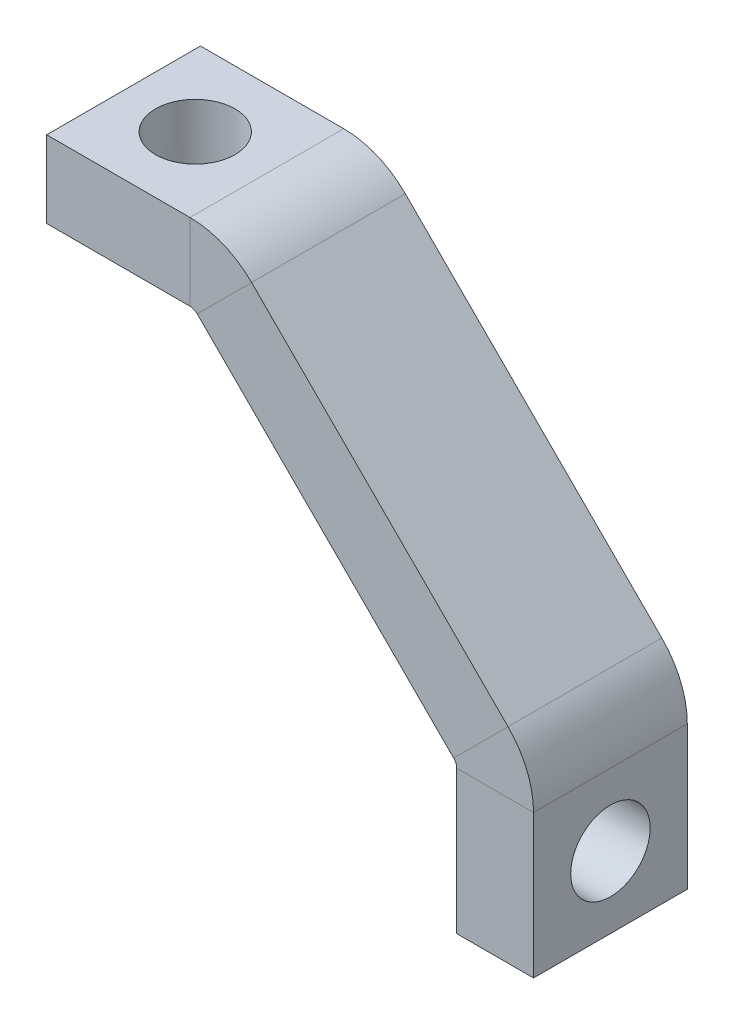
ISO-10303-21;
HEADER;
FILE_DESCRIPTION(('STEP AP214'),'2;1');
FILE_NAME('part.step','',(''),(''),'','','');
FILE_SCHEMA(('AUTOMOTIVE_DESIGN { 1 0 10303 214 1 1 1 1 }'));
ENDSEC;
DATA;
#1=APPLICATION_CONTEXT('core data for automotive mechanical design processes');
#2=APPLICATION_PROTOCOL_DEFINITION('international standard','automotive_design',2000,#1);
#3=PRODUCT_CONTEXT('',#1,'mechanical');
#4=PRODUCT('Part','Part','',(#3));
#5=PRODUCT_RELATED_PRODUCT_CATEGORY('part','',(#4));
#6=PRODUCT_DEFINITION_FORMATION('','',#4);
#7=PRODUCT_DEFINITION_CONTEXT('part definition',#1,'design');
#8=PRODUCT_DEFINITION('design','',#6,#7);
#9=PRODUCT_DEFINITION_SHAPE('','',#8);
#10=(LENGTH_UNIT() NAMED_UNIT(*) SI_UNIT(.MILLI.,.METRE.));
#11=(NAMED_UNIT(*) PLANE_ANGLE_UNIT() SI_UNIT($,.RADIAN.));
#12=(NAMED_UNIT(*) SI_UNIT($,.STERADIAN.) SOLID_ANGLE_UNIT());
#13=UNCERTAINTY_MEASURE_WITH_UNIT(LENGTH_MEASURE(1.E-05),#10,'distance_accuracy_value','');
#14=(GEOMETRIC_REPRESENTATION_CONTEXT(3) GLOBAL_UNCERTAINTY_ASSIGNED_CONTEXT((#13)) GLOBAL_UNIT_ASSIGNED_CONTEXT((#10,
#11,#12)) REPRESENTATION_CONTEXT('',''));
#15=CARTESIAN_POINT('',(0.,0.,0.));
#16=DIRECTION('',(0.,0.,1.));
#17=DIRECTION('',(1.,0.,0.));
#18=AXIS2_PLACEMENT_3D('',#15,#16,#17);
#19=CARTESIAN_POINT('',(-15.2756472385876,3.33215679776446,6.));
#20=DIRECTION('',(0.,0.,1.));
#21=DIRECTION('',(0.707106781186547,-0.707106781186548,0.));
#22=AXIS2_PLACEMENT_3D('',#19,#20,#21);
#23=PLANE('',#22);
#24=DIRECTION('',(-0.707106781186548,-0.707106781186547,0.));
#25=VECTOR('',#24,1.);
#26=CARTESIAN_POINT('',(-4.2714841825533,-7.6720062582698,6.));
#27=LINE('',#26,#25);
#28=CARTESIAN_POINT('',(-4.2714841825533,-7.6720062582698,6.));
#29=VERTEX_POINT('',#28);
#30=CARTESIAN_POINT('',(-6.39280452611294,-9.79332660182944,6.));
#31=VERTEX_POINT('',#30);
#32=EDGE_CURVE('E11',#29,#31,#27,.T.);
#33=ORIENTED_EDGE('',*,*,#32,.F.);
#34=DIRECTION('',(0.707106781186547,-0.707106781186548,0.));
#35=VECTOR('',#34,1.);
#36=CARTESIAN_POINT('',(-15.2756472385876,3.33215679776446,6.));
#37=LINE('',#36,#35);
#38=CARTESIAN_POINT('',(-14.2798102946218,2.33631985379872,6.));
#39=VERTEX_POINT('',#38);
#40=EDGE_CURVE('E145',#39,#29,#37,.T.);
#41=ORIENTED_EDGE('',*,*,#40,.F.);
#42=DIRECTION('',(-0.707106781186547,-0.707106781186547,0.));
#43=VECTOR('',#42,1.);
#44=CARTESIAN_POINT('',(-14.2798102946218,2.33631985379872,6.));
#45=LINE('',#44,#43);
#46=CARTESIAN_POINT('',(-16.4011306381815,0.214999510239078,6.));
#47=VERTEX_POINT('',#46);
#48=EDGE_CURVE('E49',#39,#47,#45,.T.);
#49=ORIENTED_EDGE('',*,*,#48,.T.);
#50=DIRECTION('',(-0.707106781186547,0.707106781186548,0.));
#51=VECTOR('',#50,1.);
#52=CARTESIAN_POINT('',(-17.3969675821472,1.21083645420482,6.));
#53=LINE('',#52,#51);
#54=EDGE_CURVE('E251',#47,#31,#53,.F.);
#55=ORIENTED_EDGE('',*,*,#54,.T.);
#56=EDGE_LOOP('',(#33,#41,#49,#55));
#57=FACE_BOUND('',#56,.T.);
#58=ADVANCED_FACE('F39',(#57),#23,.T.);
#59=CARTESIAN_POINT('',(-16.6839733506561,-0.0678432022355408,6.));
#60=DIRECTION('',(0.,0.,1.));
#61=DIRECTION('',(1.,0.,0.));
#62=AXIS2_PLACEMENT_3D('',#59,#60,#61);
#63=PLANE('',#62);
#64=ORIENTED_EDGE('',*,*,#48,.F.);
#65=CARTESIAN_POINT('',(-16.6839733506561,-0.0678432022355408,6.));
#66=DIRECTION('',(0.,0.,-1.));
#67=DIRECTION('',(-1.,0.,0.));
#68=AXIS2_PLACEMENT_3D('',#65,#66,#67);
#69=CIRCLE('',#68,3.4);
#70=CARTESIAN_POINT('',(-16.6839733506561,3.33215679776446,6.));
#71=VERTEX_POINT('',#70);
#72=EDGE_CURVE('E160',#39,#71,#69,.F.);
#73=ORIENTED_EDGE('',*,*,#72,.T.);
#74=DIRECTION('',(0.,-1.,0.));
#75=VECTOR('',#74,1.);
#76=CARTESIAN_POINT('',(-16.6839733506561,3.33215679776446,6.));
#77=LINE('',#76,#75);
#78=CARTESIAN_POINT('',(-16.6839733506561,0.332156797764459,6.));
#79=VERTEX_POINT('',#78);
#80=EDGE_CURVE('E211',#71,#79,#77,.T.);
#81=ORIENTED_EDGE('',*,*,#80,.T.);
#82=CARTESIAN_POINT('',(-16.6839733506561,-0.0678432022355408,6.));
#83=DIRECTION('',(0.,0.,1.));
#84=DIRECTION('',(1.,0.,0.));
#85=AXIS2_PLACEMENT_3D('',#82,#83,#84);
#86=CIRCLE('',#85,0.4);
#87=EDGE_CURVE('E252',#47,#79,#86,.T.);
#88=ORIENTED_EDGE('',*,*,#87,.F.);
#89=EDGE_LOOP('',(#64,#73,#81,#88));
#90=FACE_BOUND('',#89,.T.);
#91=ADVANCED_FACE('F298',(#90),#63,.T.);
#92=CARTESIAN_POINT('',(-22.2756472385876,3.33215679776446,6.));
#93=DIRECTION('',(0.,0.,1.));
#94=DIRECTION('',(1.,0.,0.));
#95=AXIS2_PLACEMENT_3D('',#92,#93,#94);
#96=PLANE('',#95);
#97=ORIENTED_EDGE('',*,*,#80,.F.);
#98=DIRECTION('',(1.,0.,0.));
#99=VECTOR('',#98,1.);
#100=CARTESIAN_POINT('',(-22.2756472385876,3.33215679776446,6.));
#101=LINE('',#100,#99);
#102=CARTESIAN_POINT('',(-22.2756472385876,3.33215679776446,6.));
#103=VERTEX_POINT('',#102);
#104=EDGE_CURVE('E173',#103,#71,#101,.T.);
#105=ORIENTED_EDGE('',*,*,#104,.F.);
#106=DIRECTION('',(0.,-1.,0.));
#107=VECTOR('',#106,1.);
#108=CARTESIAN_POINT('',(-22.2756472385876,3.33215679776446,6.));
#109=LINE('',#108,#107);
#110=CARTESIAN_POINT('',(-22.2756472385876,0.332156797764459,6.));
#111=VERTEX_POINT('',#110);
#112=EDGE_CURVE('E209',#103,#111,#109,.T.);
#113=ORIENTED_EDGE('',*,*,#112,.T.);
#114=DIRECTION('',(-1.,0.,0.));
#115=VECTOR('',#114,1.);
#116=CARTESIAN_POINT('',(-22.2756472385876,0.332156797764459,6.));
#117=LINE('',#116,#115);
#118=EDGE_CURVE('E259',#111,#79,#117,.F.);
#119=ORIENTED_EDGE('',*,*,#118,.T.);
#120=EDGE_LOOP('',(#97,#105,#113,#119));
#121=FACE_BOUND('',#120,.T.);
#122=ADVANCED_FACE('F302',(#121),#96,.T.);
#123=CARTESIAN_POINT('',(-22.2756472385876,3.33215679776446,6.));
#124=DIRECTION('',(1.,0.,0.));
#125=DIRECTION('',(0.,0.,-1.));
#126=AXIS2_PLACEMENT_3D('',#123,#124,#125);
#127=PLANE('',#126);
#128=ORIENTED_EDGE('',*,*,#112,.F.);
#129=DIRECTION('',(0.,0.,-1.));
#130=VECTOR('',#129,1.);
#131=CARTESIAN_POINT('',(-22.2756472385876,3.33215679776446,6.));
#132=LINE('',#131,#130);
#133=CARTESIAN_POINT('',(-22.2756472385876,3.33215679776446,0.));
#134=VERTEX_POINT('',#133);
#135=EDGE_CURVE('E176',#103,#134,#132,.T.);
#136=ORIENTED_EDGE('',*,*,#135,.T.);
#137=DIRECTION('',(0.,-1.,0.));
#138=VECTOR('',#137,1.);
#139=CARTESIAN_POINT('',(-22.2756472385876,3.33215679776446,0.));
#140=LINE('',#139,#138);
#141=CARTESIAN_POINT('',(-22.2756472385876,0.332156797764459,0.));
#142=VERTEX_POINT('',#141);
#143=EDGE_CURVE('E207',#134,#142,#140,.T.);
#144=ORIENTED_EDGE('',*,*,#143,.T.);
#145=DIRECTION('',(0.,0.,1.));
#146=VECTOR('',#145,1.);
#147=CARTESIAN_POINT('',(-22.2756472385876,0.332156797764459,6.));
#148=LINE('',#147,#146);
#149=EDGE_CURVE('E247',#111,#142,#148,.F.);
#150=ORIENTED_EDGE('',*,*,#149,.F.);
#151=EDGE_LOOP('',(#128,#136,#144,#150));
#152=FACE_BOUND('',#151,.T.);
#153=ADVANCED_FACE('F308',(#152),#127,.F.);
#154=CARTESIAN_POINT('',(-22.2756472385876,3.33215679776446,0.));
#155=DIRECTION('',(0.,0.,1.));
#156=DIRECTION('',(1.,0.,0.));
#157=AXIS2_PLACEMENT_3D('',#154,#155,#156);
#158=PLANE('',#157);
#159=ORIENTED_EDGE('',*,*,#143,.F.);
#160=DIRECTION('',(1.,0.,0.));
#161=VECTOR('',#160,1.);
#162=CARTESIAN_POINT('',(-22.2756472385876,3.33215679776446,0.));
#163=LINE('',#162,#161);
#164=CARTESIAN_POINT('',(-16.6839733506561,3.33215679776446,0.));
#165=VERTEX_POINT('',#164);
#166=EDGE_CURVE('E162',#134,#165,#163,.T.);
#167=ORIENTED_EDGE('',*,*,#166,.T.);
#168=DIRECTION('',(0.,-1.,0.));
#169=VECTOR('',#168,1.);
#170=CARTESIAN_POINT('',(-16.6839733506561,3.33215679776446,0.));
#171=LINE('',#170,#169);
#172=CARTESIAN_POINT('',(-16.6839733506561,0.332156797764459,0.));
#173=VERTEX_POINT('',#172);
#174=EDGE_CURVE('E205',#165,#173,#171,.T.);
#175=ORIENTED_EDGE('',*,*,#174,.T.);
#176=DIRECTION('',(-1.,0.,0.));
#177=VECTOR('',#176,1.);
#178=CARTESIAN_POINT('',(-22.2756472385876,0.332156797764459,0.));
#179=LINE('',#178,#177);
#180=EDGE_CURVE('E256',#142,#173,#179,.F.);
#181=ORIENTED_EDGE('',*,*,#180,.F.);
#182=EDGE_LOOP('',(#159,#167,#175,#181));
#183=FACE_BOUND('',#182,.T.);
#184=ADVANCED_FACE('F312',(#183),#158,.F.);
#185=CARTESIAN_POINT('',(-16.6839733506561,-0.0678432022355408,0.));
#186=DIRECTION('',(0.,0.,-1.));
#187=DIRECTION('',(-1.,0.,0.));
#188=AXIS2_PLACEMENT_3D('',#185,#186,#187);
#189=PLANE('',#188);
#190=ORIENTED_EDGE('',*,*,#174,.F.);
#191=CARTESIAN_POINT('',(-16.6839733506561,-0.0678432022355408,0.));
#192=DIRECTION('',(0.,0.,1.));
#193=DIRECTION('',(1.,0.,0.));
#194=AXIS2_PLACEMENT_3D('',#191,#192,#193);
#195=CIRCLE('',#194,3.4);
#196=CARTESIAN_POINT('',(-14.2798102946218,2.33631985379872,0.));
#197=VERTEX_POINT('',#196);
#198=EDGE_CURVE('E165',#165,#197,#195,.F.);
#199=ORIENTED_EDGE('',*,*,#198,.T.);
#200=DIRECTION('',(-0.707106781186548,-0.707106781186547,0.));
#201=VECTOR('',#200,1.);
#202=CARTESIAN_POINT('',(-14.2798102946218,2.33631985379872,0.));
#203=LINE('',#202,#201);
#204=CARTESIAN_POINT('',(-16.4011306381815,0.214999510239078,0.));
#205=VERTEX_POINT('',#204);
#206=EDGE_CURVE('E134',#197,#205,#203,.T.);
#207=ORIENTED_EDGE('',*,*,#206,.T.);
#208=CARTESIAN_POINT('',(-16.6839733506561,-0.0678432022355408,0.));
#209=DIRECTION('',(0.,0.,1.));
#210=DIRECTION('',(1.,0.,0.));
#211=AXIS2_PLACEMENT_3D('',#208,#209,#210);
#212=CIRCLE('',#211,0.4);
#213=EDGE_CURVE('E253',#173,#205,#212,.F.);
#214=ORIENTED_EDGE('',*,*,#213,.F.);
#215=EDGE_LOOP('',(#190,#199,#207,#214));
#216=FACE_BOUND('',#215,.T.);
#217=ADVANCED_FACE('F316',(#216),#189,.T.);
#218=CARTESIAN_POINT('',(-15.2756472385876,3.33215679776446,0.));
#219=DIRECTION('',(0.,0.,1.));
#220=DIRECTION('',(0.707106781186547,-0.707106781186548,0.));
#221=AXIS2_PLACEMENT_3D('',#218,#219,#220);
#222=PLANE('',#221);
#223=ORIENTED_EDGE('',*,*,#206,.F.);
#224=DIRECTION('',(0.707106781186547,-0.707106781186548,0.));
#225=VECTOR('',#224,1.);
#226=CARTESIAN_POINT('',(-15.2756472385876,3.33215679776446,0.));
#227=LINE('',#226,#225);
#228=CARTESIAN_POINT('',(-4.2714841825533,-7.6720062582698,0.));
#229=VERTEX_POINT('',#228);
#230=EDGE_CURVE('E143',#197,#229,#227,.T.);
#231=ORIENTED_EDGE('',*,*,#230,.T.);
#232=DIRECTION('',(-0.707106781186547,-0.707106781186547,0.));
#233=VECTOR('',#232,1.);
#234=CARTESIAN_POINT('',(-4.2714841825533,-7.6720062582698,0.));
#235=LINE('',#234,#233);
#236=CARTESIAN_POINT('',(-6.39280452611294,-9.79332660182944,0.));
#237=VERTEX_POINT('',#236);
#238=EDGE_CURVE('E58',#229,#237,#235,.T.);
#239=ORIENTED_EDGE('',*,*,#238,.T.);
#240=DIRECTION('',(-0.707106781186547,0.707106781186548,0.));
#241=VECTOR('',#240,1.);
#242=CARTESIAN_POINT('',(-17.3969675821472,1.21083645420482,0.));
#243=LINE('',#242,#241);
#244=EDGE_CURVE('E249',#205,#237,#243,.F.);
#245=ORIENTED_EDGE('',*,*,#244,.F.);
#246=EDGE_LOOP('',(#223,#231,#239,#245));
#247=FACE_BOUND('',#246,.T.);
#248=ADVANCED_FACE('F158',(#247),#222,.F.);
#249=CARTESIAN_POINT('',(-6.67564723858756,-10.0761693143041,0.));
#250=DIRECTION('',(0.,0.,-1.));
#251=DIRECTION('',(-1.,0.,0.));
#252=AXIS2_PLACEMENT_3D('',#249,#250,#251);
#253=PLANE('',#252);
#254=ORIENTED_EDGE('',*,*,#238,.F.);
#255=CARTESIAN_POINT('',(-6.67564723858756,-10.0761693143041,0.));
#256=DIRECTION('',(0.,0.,1.));
#257=DIRECTION('',(1.,0.,0.));
#258=AXIS2_PLACEMENT_3D('',#255,#256,#257);
#259=CIRCLE('',#258,3.4);
#260=CARTESIAN_POINT('',(-3.27564723858756,-10.0761693143041,0.));
#261=VERTEX_POINT('',#260);
#262=EDGE_CURVE('E130',#229,#261,#259,.F.);
#263=ORIENTED_EDGE('',*,*,#262,.T.);
#264=DIRECTION('',(-1.,0.,0.));
#265=VECTOR('',#264,1.);
#266=CARTESIAN_POINT('',(-3.27564723858756,-10.0761693143041,0.));
#267=LINE('',#266,#265);
#268=CARTESIAN_POINT('',(-6.27564723858756,-10.0761693143041,0.));
#269=VERTEX_POINT('',#268);
#270=EDGE_CURVE('E135',#261,#269,#267,.T.);
#271=ORIENTED_EDGE('',*,*,#270,.T.);
#272=CARTESIAN_POINT('',(-6.67564723858756,-10.0761693143041,0.));
#273=DIRECTION('',(0.,0.,1.));
#274=DIRECTION('',(1.,0.,0.));
#275=AXIS2_PLACEMENT_3D('',#272,#273,#274);
#276=CIRCLE('',#275,0.4);
#277=EDGE_CURVE('E132',#237,#269,#276,.F.);
#278=ORIENTED_EDGE('',*,*,#277,.F.);
#279=EDGE_LOOP('',(#254,#263,#271,#278));
#280=FACE_BOUND('',#279,.T.);
#281=ADVANCED_FACE('F127',(#280),#253,.T.);
#282=CARTESIAN_POINT('',(-3.27564723858756,-8.66784320223554,0.));
#283=DIRECTION('',(0.,0.,1.));
#284=DIRECTION('',(0.,-1.,0.));
#285=AXIS2_PLACEMENT_3D('',#282,#283,#284);
#286=PLANE('',#285);
#287=ORIENTED_EDGE('',*,*,#270,.F.);
#288=DIRECTION('',(0.,-1.,0.));
#289=VECTOR('',#288,1.);
#290=CARTESIAN_POINT('',(-3.27564723858756,-8.66784320223554,0.));
#291=LINE('',#290,#289);
#292=CARTESIAN_POINT('',(-3.27564723858756,-15.6678432022355,0.));
#293=VERTEX_POINT('',#292);
#294=EDGE_CURVE('E179',#261,#293,#291,.T.);
#295=ORIENTED_EDGE('',*,*,#294,.T.);
#296=DIRECTION('',(-1.,0.,0.));
#297=VECTOR('',#296,1.);
#298=CARTESIAN_POINT('',(-3.27564723858756,-15.6678432022355,0.));
#299=LINE('',#298,#297);
#300=CARTESIAN_POINT('',(-6.27564723858756,-15.6678432022355,0.));
#301=VERTEX_POINT('',#300);
#302=EDGE_CURVE('E199',#293,#301,#299,.T.);
#303=ORIENTED_EDGE('',*,*,#302,.T.);
#304=DIRECTION('',(0.,1.,0.));
#305=VECTOR('',#304,1.);
#306=CARTESIAN_POINT('',(-6.27564723858756,-8.66784320223554,0.));
#307=LINE('',#306,#305);
#308=EDGE_CURVE('E244',#269,#301,#307,.F.);
#309=ORIENTED_EDGE('',*,*,#308,.F.);
#310=EDGE_LOOP('',(#287,#295,#303,#309));
#311=FACE_BOUND('',#310,.T.);
#312=ADVANCED_FACE('F287',(#311),#286,.F.);
#313=CARTESIAN_POINT('',(-3.27564723858756,-15.6678432022355,6.));
#314=DIRECTION('',(0.,-1.,0.));
#315=DIRECTION('',(0.,0.,-1.));
#316=AXIS2_PLACEMENT_3D('',#313,#314,#315);
#317=PLANE('',#316);
#318=ORIENTED_EDGE('',*,*,#302,.F.);
#319=DIRECTION('',(0.,0.,-1.));
#320=VECTOR('',#319,1.);
#321=CARTESIAN_POINT('',(-3.27564723858756,-15.6678432022355,6.));
#322=LINE('',#321,#320);
#323=CARTESIAN_POINT('',(-3.27564723858756,-15.6678432022355,6.));
#324=VERTEX_POINT('',#323);
#325=EDGE_CURVE('E182',#324,#293,#322,.T.);
#326=ORIENTED_EDGE('',*,*,#325,.F.);
#327=DIRECTION('',(-1.,0.,0.));
#328=VECTOR('',#327,1.);
#329=CARTESIAN_POINT('',(-3.27564723858756,-15.6678432022355,6.));
#330=LINE('',#329,#328);
#331=CARTESIAN_POINT('',(-6.27564723858756,-15.6678432022355,6.));
#332=VERTEX_POINT('',#331);
#333=EDGE_CURVE('E196',#324,#332,#330,.T.);
#334=ORIENTED_EDGE('',*,*,#333,.T.);
#335=DIRECTION('',(0.,0.,-1.));
#336=VECTOR('',#335,1.);
#337=CARTESIAN_POINT('',(-6.27564723858756,-15.6678432022355,6.));
#338=LINE('',#337,#336);
#339=EDGE_CURVE('E241',#332,#301,#338,.T.);
#340=ORIENTED_EDGE('',*,*,#339,.T.);
#341=EDGE_LOOP('',(#318,#326,#334,#340));
#342=FACE_BOUND('',#341,.T.);
#343=ADVANCED_FACE('F288',(#342),#317,.T.);
#344=CARTESIAN_POINT('',(-3.27564723858756,-8.66784320223554,6.));
#345=DIRECTION('',(0.,0.,1.));
#346=DIRECTION('',(0.,-1.,0.));
#347=AXIS2_PLACEMENT_3D('',#344,#345,#346);
#348=PLANE('',#347);
#349=ORIENTED_EDGE('',*,*,#333,.F.);
#350=DIRECTION('',(0.,-1.,0.));
#351=VECTOR('',#350,1.);
#352=CARTESIAN_POINT('',(-3.27564723858756,-8.66784320223554,6.));
#353=LINE('',#352,#351);
#354=CARTESIAN_POINT('',(-3.27564723858756,-10.0761693143041,6.));
#355=VERTEX_POINT('',#354);
#356=EDGE_CURVE('E185',#355,#324,#353,.T.);
#357=ORIENTED_EDGE('',*,*,#356,.F.);
#358=DIRECTION('',(-1.,0.,0.));
#359=VECTOR('',#358,1.);
#360=CARTESIAN_POINT('',(-3.27564723858756,-10.0761693143041,6.));
#361=LINE('',#360,#359);
#362=CARTESIAN_POINT('',(-6.27564723858756,-10.0761693143041,6.));
#363=VERTEX_POINT('',#362);
#364=EDGE_CURVE('E200',#355,#363,#361,.T.);
#365=ORIENTED_EDGE('',*,*,#364,.T.);
#366=DIRECTION('',(0.,1.,0.));
#367=VECTOR('',#366,1.);
#368=CARTESIAN_POINT('',(-6.27564723858756,-8.66784320223554,6.));
#369=LINE('',#368,#367);
#370=EDGE_CURVE('E236',#363,#332,#369,.F.);
#371=ORIENTED_EDGE('',*,*,#370,.T.);
#372=EDGE_LOOP('',(#349,#357,#365,#371));
#373=FACE_BOUND('',#372,.T.);
#374=ADVANCED_FACE('F281',(#373),#348,.T.);
#375=CARTESIAN_POINT('',(-6.67564723858756,-10.0761693143041,6.));
#376=DIRECTION('',(0.,0.,1.));
#377=DIRECTION('',(1.,0.,0.));
#378=AXIS2_PLACEMENT_3D('',#375,#376,#377);
#379=PLANE('',#378);
#380=CARTESIAN_POINT('',(-6.67564723858756,-10.0761693143041,6.));
#381=DIRECTION('',(0.,0.,-1.));
#382=DIRECTION('',(-1.,0.,0.));
#383=AXIS2_PLACEMENT_3D('',#380,#381,#382);
#384=CIRCLE('',#383,3.4);
#385=EDGE_CURVE('E155',#355,#29,#384,.F.);
#386=ORIENTED_EDGE('',*,*,#385,.T.);
#387=ORIENTED_EDGE('',*,*,#32,.T.);
#388=CARTESIAN_POINT('',(-6.67564723858756,-10.0761693143041,6.));
#389=DIRECTION('',(0.,0.,1.));
#390=DIRECTION('',(1.,0.,0.));
#391=AXIS2_PLACEMENT_3D('',#388,#389,#390);
#392=CIRCLE('',#391,0.4);
#393=EDGE_CURVE('E168',#363,#31,#392,.T.);
#394=ORIENTED_EDGE('',*,*,#393,.F.);
#395=ORIENTED_EDGE('',*,*,#364,.F.);
#396=EDGE_LOOP('',(#386,#387,#394,#395));
#397=FACE_BOUND('',#396,.T.);
#398=ADVANCED_FACE('F41',(#397),#379,.T.);
#399=CARTESIAN_POINT('',(-6.27564723858756,-8.66784320223554,6.));
#400=DIRECTION('',(1.,0.,0.));
#401=DIRECTION('',(0.,0.,-1.));
#402=AXIS2_PLACEMENT_3D('',#399,#400,#401);
#403=PLANE('',#402);
#404=CARTESIAN_POINT('',(-6.27564723858756,-12.8720062582698,3.));
#405=DIRECTION('',(-1.,0.,0.));
#406=DIRECTION('',(0.,0.,1.));
#407=AXIS2_PLACEMENT_3D('',#404,#405,#406);
#408=CIRCLE('',#407,1.55);
#409=CARTESIAN_POINT('',(-6.27564723858756,-12.8720062582698,4.55));
#410=VERTEX_POINT('',#409);
#411=EDGE_CURVE('E224',#410,#410,#408,.T.);
#412=ORIENTED_EDGE('',*,*,#411,.F.);
#413=EDGE_LOOP('',(#412));
#414=FACE_BOUND('',#413,.T.);
#415=ORIENTED_EDGE('',*,*,#370,.F.);
#416=DIRECTION('',(0.,0.,-1.));
#417=VECTOR('',#416,1.);
#418=CARTESIAN_POINT('',(-6.27564723858756,-10.0761693143041,6.));
#419=LINE('',#418,#417);
#420=EDGE_CURVE('E227',#363,#269,#419,.T.);
#421=ORIENTED_EDGE('',*,*,#420,.T.);
#422=ORIENTED_EDGE('',*,*,#308,.T.);
#423=ORIENTED_EDGE('',*,*,#339,.F.);
#424=EDGE_LOOP('',(#415,#421,#422,#423));
#425=FACE_BOUND('',#424,.T.);
#426=ADVANCED_FACE('F279',(#414,#425),#403,.F.);
#427=CARTESIAN_POINT('',(-22.2756472385876,0.332156797764459,6.));
#428=DIRECTION('',(0.,1.,0.));
#429=DIRECTION('',(-1.,0.,0.));
#430=AXIS2_PLACEMENT_3D('',#427,#428,#429);
#431=PLANE('',#430);
#432=CARTESIAN_POINT('',(-19.4798102946218,0.33215679776446,3.));
#433=DIRECTION('',(0.,-1.,0.));
#434=DIRECTION('',(1.,0.,0.));
#435=AXIS2_PLACEMENT_3D('',#432,#433,#434);
#436=CIRCLE('',#435,1.55);
#437=CARTESIAN_POINT('',(-17.9298102946218,0.33215679776446,3.));
#438=VERTEX_POINT('',#437);
#439=EDGE_CURVE('E216',#438,#438,#436,.T.);
#440=ORIENTED_EDGE('',*,*,#439,.F.);
#441=EDGE_LOOP('',(#440));
#442=FACE_BOUND('',#441,.T.);
#443=ORIENTED_EDGE('',*,*,#180,.T.);
#444=DIRECTION('',(0.,0.,1.));
#445=VECTOR('',#444,1.);
#446=CARTESIAN_POINT('',(-16.6839733506561,0.332156797764459,6.));
#447=LINE('',#446,#445);
#448=EDGE_CURVE('E230',#173,#79,#447,.T.);
#449=ORIENTED_EDGE('',*,*,#448,.T.);
#450=ORIENTED_EDGE('',*,*,#118,.F.);
#451=ORIENTED_EDGE('',*,*,#149,.T.);
#452=EDGE_LOOP('',(#443,#449,#450,#451));
#453=FACE_BOUND('',#452,.T.);
#454=ADVANCED_FACE('F365',(#442,#453),#431,.F.);
#455=CARTESIAN_POINT('',(-17.3969675821472,1.21083645420482,6.));
#456=DIRECTION('',(0.707106781186548,0.707106781186547,0.));
#457=DIRECTION('',(-0.707106781186547,0.707106781186548,0.));
#458=AXIS2_PLACEMENT_3D('',#455,#456,#457);
#459=PLANE('',#458);
#460=ORIENTED_EDGE('',*,*,#244,.T.);
#461=DIRECTION('',(0.,0.,1.));
#462=VECTOR('',#461,1.);
#463=CARTESIAN_POINT('',(-6.39280452611294,-9.79332660182944,6.));
#464=LINE('',#463,#462);
#465=EDGE_CURVE('E214',#237,#31,#464,.T.);
#466=ORIENTED_EDGE('',*,*,#465,.T.);
#467=ORIENTED_EDGE('',*,*,#54,.F.);
#468=DIRECTION('',(0.,0.,1.));
#469=VECTOR('',#468,1.);
#470=CARTESIAN_POINT('',(-16.4011306381815,0.214999510239078,6.));
#471=LINE('',#470,#469);
#472=EDGE_CURVE('E233',#47,#205,#471,.F.);
#473=ORIENTED_EDGE('',*,*,#472,.T.);
#474=EDGE_LOOP('',(#460,#466,#467,#473));
#475=FACE_BOUND('',#474,.T.);
#476=ADVANCED_FACE('F268',(#475),#459,.F.);
#477=CARTESIAN_POINT('',(-16.6839733506561,-0.0678432022355408,6.));
#478=DIRECTION('',(0.,0.,1.));
#479=DIRECTION('',(1.,0.,0.));
#480=AXIS2_PLACEMENT_3D('',#477,#478,#479);
#481=CYLINDRICAL_SURFACE('',#480,0.4);
#482=ORIENTED_EDGE('',*,*,#87,.T.);
#483=ORIENTED_EDGE('',*,*,#448,.F.);
#484=ORIENTED_EDGE('',*,*,#213,.T.);
#485=ORIENTED_EDGE('',*,*,#472,.F.);
#486=EDGE_LOOP('',(#482,#483,#484,#485));
#487=FACE_BOUND('',#486,.T.);
#488=ADVANCED_FACE('F364',(#487),#481,.F.);
#489=CARTESIAN_POINT('',(-6.67564723858756,-10.0761693143041,6.));
#490=DIRECTION('',(0.,0.,1.));
#491=DIRECTION('',(1.,0.,0.));
#492=AXIS2_PLACEMENT_3D('',#489,#490,#491);
#493=CYLINDRICAL_SURFACE('',#492,0.4);
#494=ORIENTED_EDGE('',*,*,#393,.T.);
#495=ORIENTED_EDGE('',*,*,#465,.F.);
#496=ORIENTED_EDGE('',*,*,#277,.T.);
#497=ORIENTED_EDGE('',*,*,#420,.F.);
#498=EDGE_LOOP('',(#494,#495,#496,#497));
#499=FACE_BOUND('',#498,.T.);
#500=ADVANCED_FACE('F271',(#499),#493,.F.);
#501=CARTESIAN_POINT('',(-3.27564723858756,-8.66784320223554,6.));
#502=DIRECTION('',(1.,0.,0.));
#503=DIRECTION('',(0.,0.,-1.));
#504=AXIS2_PLACEMENT_3D('',#501,#502,#503);
#505=PLANE('',#504);
#506=CARTESIAN_POINT('',(-3.27564723858756,-12.8720062582698,3.));
#507=DIRECTION('',(1.,0.,0.));
#508=DIRECTION('',(0.,0.,-1.));
#509=AXIS2_PLACEMENT_3D('',#506,#507,#508);
#510=CIRCLE('',#509,1.55);
#511=CARTESIAN_POINT('',(-3.27564723858756,-12.8720062582698,1.45));
#512=VERTEX_POINT('',#511);
#513=EDGE_CURVE('E43',#512,#512,#510,.T.);
#514=ORIENTED_EDGE('',*,*,#513,.F.);
#515=EDGE_LOOP('',(#514));
#516=FACE_BOUND('',#515,.T.);
#517=ORIENTED_EDGE('',*,*,#356,.T.);
#518=ORIENTED_EDGE('',*,*,#325,.T.);
#519=ORIENTED_EDGE('',*,*,#294,.F.);
#520=DIRECTION('',(0.,0.,-1.));
#521=VECTOR('',#520,1.);
#522=CARTESIAN_POINT('',(-3.27564723858756,-10.0761693143041,0.));
#523=LINE('',#522,#521);
#524=EDGE_CURVE('E149',#355,#261,#523,.T.);
#525=ORIENTED_EDGE('',*,*,#524,.F.);
#526=EDGE_LOOP('',(#517,#518,#519,#525));
#527=FACE_BOUND('',#526,.T.);
#528=ADVANCED_FACE('F387',(#516,#527),#505,.T.);
#529=CARTESIAN_POINT('',(-22.2756472385876,3.33215679776446,6.));
#530=DIRECTION('',(0.,1.,0.));
#531=DIRECTION('',(-1.,0.,0.));
#532=AXIS2_PLACEMENT_3D('',#529,#530,#531);
#533=PLANE('',#532);
#534=CARTESIAN_POINT('',(-19.4798102946218,3.33215679776446,3.));
#535=DIRECTION('',(0.,1.,0.));
#536=DIRECTION('',(-1.,0.,0.));
#537=AXIS2_PLACEMENT_3D('',#534,#535,#536);
#538=CIRCLE('',#537,1.55);
#539=CARTESIAN_POINT('',(-21.0298102946218,3.33215679776446,3.));
#540=VERTEX_POINT('',#539);
#541=EDGE_CURVE('E156',#540,#540,#538,.T.);
#542=ORIENTED_EDGE('',*,*,#541,.F.);
#543=EDGE_LOOP('',(#542));
#544=FACE_BOUND('',#543,.T.);
#545=ORIENTED_EDGE('',*,*,#166,.F.);
#546=ORIENTED_EDGE('',*,*,#135,.F.);
#547=ORIENTED_EDGE('',*,*,#104,.T.);
#548=DIRECTION('',(0.,0.,-1.));
#549=VECTOR('',#548,1.);
#550=CARTESIAN_POINT('',(-16.6839733506561,3.33215679776446,6.));
#551=LINE('',#550,#549);
#552=EDGE_CURVE('E190',#165,#71,#551,.F.);
#553=ORIENTED_EDGE('',*,*,#552,.F.);
#554=EDGE_LOOP('',(#545,#546,#547,#553));
#555=FACE_BOUND('',#554,.T.);
#556=ADVANCED_FACE('F400',(#544,#555),#533,.T.);
#557=CARTESIAN_POINT('',(-15.2756472385876,3.33215679776446,6.));
#558=DIRECTION('',(0.707106781186548,0.707106781186547,0.));
#559=DIRECTION('',(-0.707106781186547,0.707106781186548,0.));
#560=AXIS2_PLACEMENT_3D('',#557,#558,#559);
#561=PLANE('',#560);
#562=ORIENTED_EDGE('',*,*,#230,.F.);
#563=DIRECTION('',(0.,0.,-1.));
#564=VECTOR('',#563,1.);
#565=CARTESIAN_POINT('',(-14.2798102946218,2.33631985379872,0.));
#566=LINE('',#565,#564);
#567=EDGE_CURVE('E188',#39,#197,#566,.T.);
#568=ORIENTED_EDGE('',*,*,#567,.F.);
#569=ORIENTED_EDGE('',*,*,#40,.T.);
#570=DIRECTION('',(0.,0.,-1.));
#571=VECTOR('',#570,1.);
#572=CARTESIAN_POINT('',(-4.2714841825533,-7.6720062582698,6.));
#573=LINE('',#572,#571);
#574=EDGE_CURVE('E140',#229,#29,#573,.F.);
#575=ORIENTED_EDGE('',*,*,#574,.F.);
#576=EDGE_LOOP('',(#562,#568,#569,#575));
#577=FACE_BOUND('',#576,.T.);
#578=ADVANCED_FACE('F141',(#577),#561,.T.);
#579=CARTESIAN_POINT('',(-16.6839733506561,-0.0678432022355408,6.));
#580=DIRECTION('',(0.,0.,1.));
#581=DIRECTION('',(1.,0.,0.));
#582=AXIS2_PLACEMENT_3D('',#579,#580,#581);
#583=CYLINDRICAL_SURFACE('',#582,3.4);
#584=ORIENTED_EDGE('',*,*,#72,.F.);
#585=ORIENTED_EDGE('',*,*,#567,.T.);
#586=ORIENTED_EDGE('',*,*,#198,.F.);
#587=ORIENTED_EDGE('',*,*,#552,.T.);
#588=EDGE_LOOP('',(#584,#585,#586,#587));
#589=FACE_BOUND('',#588,.T.);
#590=ADVANCED_FACE('F399',(#589),#583,.T.);
#591=CARTESIAN_POINT('',(-6.67564723858756,-10.0761693143041,6.));
#592=DIRECTION('',(0.,0.,1.));
#593=DIRECTION('',(1.,0.,0.));
#594=AXIS2_PLACEMENT_3D('',#591,#592,#593);
#595=CYLINDRICAL_SURFACE('',#594,3.4);
#596=ORIENTED_EDGE('',*,*,#385,.F.);
#597=ORIENTED_EDGE('',*,*,#524,.T.);
#598=ORIENTED_EDGE('',*,*,#262,.F.);
#599=ORIENTED_EDGE('',*,*,#574,.T.);
#600=EDGE_LOOP('',(#596,#597,#598,#599));
#601=FACE_BOUND('',#600,.T.);
#602=ADVANCED_FACE('F152',(#601),#595,.T.);
#603=CARTESIAN_POINT('',(-19.4798102946218,8.33215679776446,3.));
#604=DIRECTION('',(0.,-1.,0.));
#605=DIRECTION('',(1.,0.,0.));
#606=AXIS2_PLACEMENT_3D('',#603,#604,#605);
#607=CYLINDRICAL_SURFACE('',#606,1.55);
#608=ORIENTED_EDGE('',*,*,#541,.T.);
#609=EDGE_LOOP('',(#608));
#610=FACE_BOUND('',#609,.T.);
#611=ORIENTED_EDGE('',*,*,#439,.T.);
#612=EDGE_LOOP('',(#611));
#613=FACE_BOUND('',#612,.T.);
#614=ADVANCED_FACE('F422',(#610,#613),#607,.F.);
#615=CARTESIAN_POINT('',(1.72435276141244,-12.8720062582698,3.));
#616=DIRECTION('',(-1.,0.,0.));
#617=DIRECTION('',(0.,0.,1.));
#618=AXIS2_PLACEMENT_3D('',#615,#616,#617);
#619=CYLINDRICAL_SURFACE('',#618,1.55);
#620=ORIENTED_EDGE('',*,*,#513,.T.);
#621=EDGE_LOOP('',(#620));
#622=FACE_BOUND('',#621,.T.);
#623=ORIENTED_EDGE('',*,*,#411,.T.);
#624=EDGE_LOOP('',(#623));
#625=FACE_BOUND('',#624,.T.);
#626=ADVANCED_FACE('F448',(#622,#625),#619,.F.);
#627=CLOSED_SHELL('',(#58,#91,#122,#153,#184,#217,#248,#281,#312,#343,#374,#398,#426,#454,#476,
#488,#500,#528,#556,#578,#590,#602,#614,#626));
#628=MANIFOLD_SOLID_BREP('B2',#627);
#629=ADVANCED_BREP_SHAPE_REPRESENTATION('',(#18,#628),#14);
#630=SHAPE_DEFINITION_REPRESENTATION(#9,#629);
ENDSEC;
END-ISO-10303-21;
